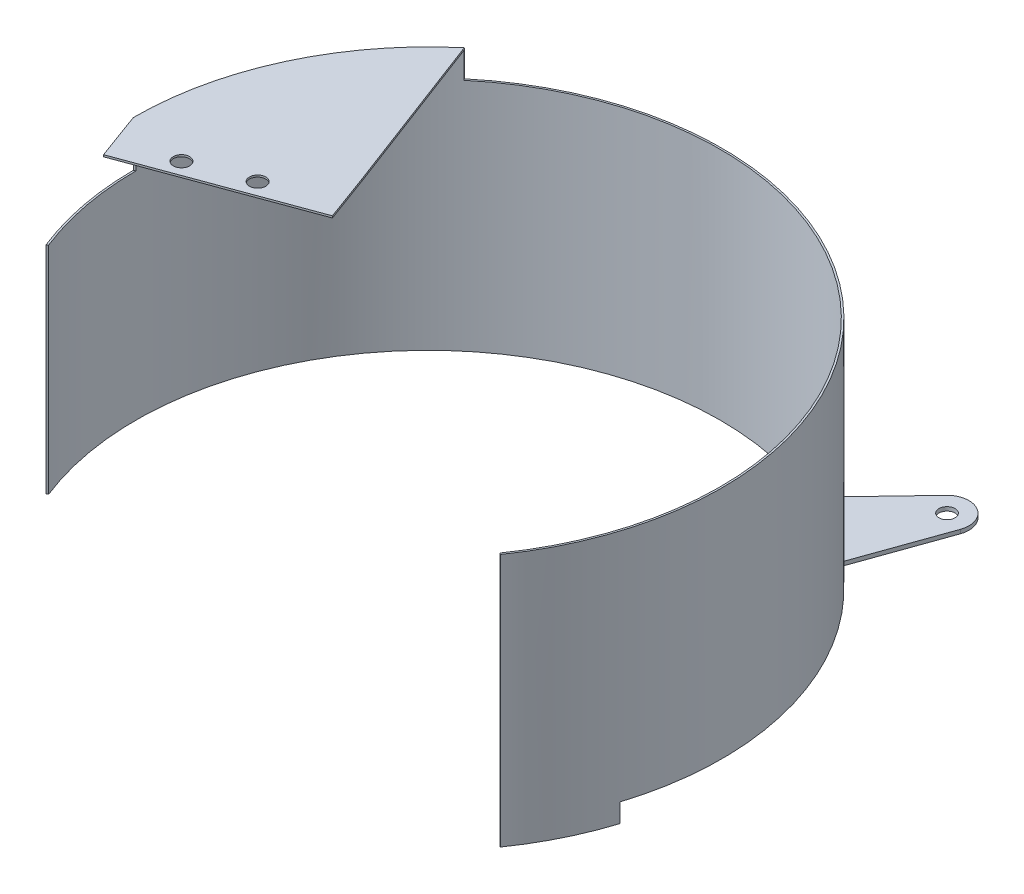
ISO-10303-21;
HEADER;
FILE_DESCRIPTION(('STEP AP214'),'2;1');
FILE_NAME('part.step','',(''),(''),'','','');
FILE_SCHEMA(('AUTOMOTIVE_DESIGN { 1 0 10303 214 1 1 1 1 }'));
ENDSEC;
DATA;
#1=APPLICATION_CONTEXT('core data for automotive mechanical design processes');
#2=APPLICATION_PROTOCOL_DEFINITION('international standard','automotive_design',2000,#1);
#3=PRODUCT_CONTEXT('',#1,'mechanical');
#4=PRODUCT('Part','Part','',(#3));
#5=PRODUCT_RELATED_PRODUCT_CATEGORY('part','',(#4));
#6=PRODUCT_DEFINITION_FORMATION('','',#4);
#7=PRODUCT_DEFINITION_CONTEXT('part definition',#1,'design');
#8=PRODUCT_DEFINITION('design','',#6,#7);
#9=PRODUCT_DEFINITION_SHAPE('','',#8);
#10=(LENGTH_UNIT() NAMED_UNIT(*) SI_UNIT(.MILLI.,.METRE.));
#11=(NAMED_UNIT(*) PLANE_ANGLE_UNIT() SI_UNIT($,.RADIAN.));
#12=(NAMED_UNIT(*) SI_UNIT($,.STERADIAN.) SOLID_ANGLE_UNIT());
#13=UNCERTAINTY_MEASURE_WITH_UNIT(LENGTH_MEASURE(1.E-05),#10,'distance_accuracy_value','');
#14=(GEOMETRIC_REPRESENTATION_CONTEXT(3) GLOBAL_UNCERTAINTY_ASSIGNED_CONTEXT((#13)) GLOBAL_UNIT_ASSIGNED_CONTEXT((#10,
#11,#12)) REPRESENTATION_CONTEXT('',''));
#15=CARTESIAN_POINT('',(0.,0.,0.));
#16=DIRECTION('',(0.,0.,1.));
#17=DIRECTION('',(1.,0.,0.));
#18=AXIS2_PLACEMENT_3D('',#15,#16,#17);
#19=CARTESIAN_POINT('',(-119.379693575983,7.61999999999996,0.2704842037125));
#20=DIRECTION('',(0.344827586206966,0.,0.938666040607988));
#21=DIRECTION('',(0.938666040607988,0.,-0.344827586206966));
#22=AXIS2_PLACEMENT_3D('',#19,#20,#21);
#23=PLANE('',#22);
#24=DIRECTION('',(0.938666040607988,0.,-0.344827586206966));
#25=VECTOR('',#24,1.);
#26=CARTESIAN_POINT('',(-119.379693575983,95.25,0.2704842037125));
#27=LINE('',#26,#25);
#28=CARTESIAN_POINT('',(-119.379693575983,95.25,0.2704842037125));
#29=VERTEX_POINT('',#28);
#30=CARTESIAN_POINT('',(-118.6434,95.25,0.));
#31=VERTEX_POINT('',#30);
#32=EDGE_CURVE('E63',#29,#31,#27,.T.);
#33=ORIENTED_EDGE('',*,*,#32,.T.);
#34=DIRECTION('',(0.,-1.,0.));
#35=VECTOR('',#34,1.);
#36=CARTESIAN_POINT('',(-118.6434,102.87,0.));
#37=LINE('',#36,#35);
#38=CARTESIAN_POINT('',(-118.6434,113.03,0.));
#39=VERTEX_POINT('',#38);
#40=EDGE_CURVE('E325',#39,#31,#37,.T.);
#41=ORIENTED_EDGE('',*,*,#40,.F.);
#42=DIRECTION('',(0.938666040607988,0.,-0.344827586206966));
#43=VECTOR('',#42,1.);
#44=CARTESIAN_POINT('',(-119.379693575983,113.03,0.270484203712493));
#45=LINE('',#44,#43);
#46=CARTESIAN_POINT('',(-119.379693575983,113.03,0.2704842037125));
#47=VERTEX_POINT('',#46);
#48=EDGE_CURVE('E255',#47,#39,#45,.T.);
#49=ORIENTED_EDGE('',*,*,#48,.F.);
#50=DIRECTION('',(0.,1.,0.));
#51=VECTOR('',#50,1.);
#52=CARTESIAN_POINT('',(-119.379693575983,7.61999999999996,0.2704842037125));
#53=LINE('',#52,#51);
#54=EDGE_CURVE('E68',#29,#47,#53,.T.);
#55=ORIENTED_EDGE('',*,*,#54,.F.);
#56=EDGE_LOOP('',(#33,#41,#49,#55));
#57=FACE_BOUND('',#56,.T.);
#58=ADVANCED_FACE('F45',(#57),#23,.T.);
#59=CARTESIAN_POINT('',(-8.68307739513456E-12,113.03,-4.05590009722013E-12));
#60=DIRECTION('',(0.,-1.,0.));
#61=DIRECTION('',(0.,0.,-1.));
#62=AXIS2_PLACEMENT_3D('',#59,#60,#61);
#63=PLANE('',#62);
#64=DIRECTION('',(-0.354304631179803,0.,-0.935130059577032));
#65=VECTOR('',#64,1.);
#66=CARTESIAN_POINT('',(-51.440692330775,113.03,-24.6875315284033));
#67=LINE('',#66,#65);
#68=CARTESIAN_POINT('',(-76.4594448936933,113.03,-90.7205029202786));
#69=VERTEX_POINT('',#68);
#70=CARTESIAN_POINT('',(-76.7359848443851,113.03,-91.4503856195385));
#71=VERTEX_POINT('',#70);
#72=EDGE_CURVE('E11',#69,#71,#67,.T.);
#73=ORIENTED_EDGE('',*,*,#72,.F.);
#74=CARTESIAN_POINT('',(-8.68307739513456E-12,113.03,-4.05590009722013E-12));
#75=DIRECTION('',(0.,-1.,0.));
#76=DIRECTION('',(0.,0.,-1.));
#77=AXIS2_PLACEMENT_3D('',#74,#75,#76);
#78=CIRCLE('',#77,118.643399999991);
#79=CARTESIAN_POINT('',(-76.26250749109,113.03,-90.8861172827371));
#80=VERTEX_POINT('',#79);
#81=EDGE_CURVE('E295',#69,#80,#78,.T.);
#82=ORIENTED_EDGE('',*,*,#81,.T.);
#83=DIRECTION('',(-0.642787609686567,0.,-0.766044443118955));
#84=VECTOR('',#83,1.);
#85=CARTESIAN_POINT('',(-76.7359848443851,113.03,-91.4503856195385));
#86=LINE('',#85,#84);
#87=EDGE_CURVE('E294',#80,#71,#86,.T.);
#88=ORIENTED_EDGE('',*,*,#87,.T.);
#89=EDGE_LOOP('',(#73,#82,#88));
#90=FACE_BOUND('',#89,.T.);
#91=ADVANCED_FACE('F380',(#90),#63,.F.);
#92=CARTESIAN_POINT('',(0.,102.87,0.));
#93=DIRECTION('',(0.,-1.,0.));
#94=DIRECTION('',(0.,0.,-1.));
#95=AXIS2_PLACEMENT_3D('',#92,#93,#94);
#96=CYLINDRICAL_SURFACE('',#95,118.6434);
#97=CARTESIAN_POINT('',(0.,7.62,0.));
#98=DIRECTION('',(0.,-1.,0.));
#99=DIRECTION('',(0.,0.,-1.));
#100=AXIS2_PLACEMENT_3D('',#97,#98,#99);
#101=CIRCLE('',#100,118.6434);
#102=CARTESIAN_POINT('',(-110.311843525834,7.62,43.6755485539894));
#103=VERTEX_POINT('',#102);
#104=CARTESIAN_POINT('',(113.152221674402,7.62,35.6767584529046));
#105=VERTEX_POINT('',#104);
#106=EDGE_CURVE('E175',#103,#105,#101,.T.);
#107=ORIENTED_EDGE('',*,*,#106,.T.);
#108=DIRECTION('',(0.,-1.,0.));
#109=VECTOR('',#108,1.);
#110=CARTESIAN_POINT('',(113.152221674402,7.62,35.6767584529046));
#111=LINE('',#110,#109);
#112=CARTESIAN_POINT('',(113.152221674402,0.,35.6767584529048));
#113=VERTEX_POINT('',#112);
#114=EDGE_CURVE('E307',#105,#113,#111,.T.);
#115=ORIENTED_EDGE('',*,*,#114,.T.);
#116=CARTESIAN_POINT('',(0.,0.,0.));
#117=DIRECTION('',(0.,1.,0.));
#118=DIRECTION('',(1.,0.,0.));
#119=AXIS2_PLACEMENT_3D('',#116,#117,#118);
#120=CIRCLE('',#119,118.6434);
#121=CARTESIAN_POINT('',(97.186983651397,0.,68.0510585685711));
#122=VERTEX_POINT('',#121);
#123=EDGE_CURVE('E186',#113,#122,#120,.F.);
#124=ORIENTED_EDGE('',*,*,#123,.T.);
#125=DIRECTION('',(0.,-1.,0.));
#126=VECTOR('',#125,1.);
#127=CARTESIAN_POINT('',(97.186983651397,102.87,68.0510585685711));
#128=LINE('',#127,#126);
#129=CARTESIAN_POINT('',(97.186983651397,102.87,68.0510585685711));
#130=VERTEX_POINT('',#129);
#131=EDGE_CURVE('E54',#130,#122,#128,.T.);
#132=ORIENTED_EDGE('',*,*,#131,.F.);
#133=CARTESIAN_POINT('',(0.,102.87,0.));
#134=DIRECTION('',(0.,1.,0.));
#135=DIRECTION('',(1.,0.,0.));
#136=AXIS2_PLACEMENT_3D('',#133,#134,#135);
#137=CIRCLE('',#136,118.6434);
#138=CARTESIAN_POINT('',(-76.26250749109,102.87,-90.8861172827371));
#139=VERTEX_POINT('',#138);
#140=EDGE_CURVE('E317',#139,#130,#137,.F.);
#141=ORIENTED_EDGE('',*,*,#140,.F.);
#142=DIRECTION('',(0.,-1.,0.));
#143=VECTOR('',#142,1.);
#144=CARTESIAN_POINT('',(-76.26250749109,113.03,-90.8861172827371));
#145=LINE('',#144,#143);
#146=EDGE_CURVE('E303',#80,#139,#145,.T.);
#147=ORIENTED_EDGE('',*,*,#146,.F.);
#148=ORIENTED_EDGE('',*,*,#81,.F.);
#149=EDGE_CURVE('E291',#39,#69,#78,.T.);
#150=ORIENTED_EDGE('',*,*,#149,.F.);
#151=ORIENTED_EDGE('',*,*,#40,.T.);
#152=CARTESIAN_POINT('',(0.,95.25,0.));
#153=DIRECTION('',(0.,1.,0.));
#154=DIRECTION('',(0.,0.,1.));
#155=AXIS2_PLACEMENT_3D('',#152,#153,#154);
#156=CIRCLE('',#155,118.6434);
#157=CARTESIAN_POINT('',(-110.311843525834,95.25,43.6755485539894));
#158=VERTEX_POINT('',#157);
#159=EDGE_CURVE('E192',#31,#158,#156,.T.);
#160=ORIENTED_EDGE('',*,*,#159,.T.);
#161=DIRECTION('',(0.,1.,0.));
#162=VECTOR('',#161,1.);
#163=CARTESIAN_POINT('',(-110.311843525834,-37.4986959455729,43.6755485539894));
#164=LINE('',#163,#162);
#165=EDGE_CURVE('E190',#103,#158,#164,.T.);
#166=ORIENTED_EDGE('',*,*,#165,.F.);
#167=EDGE_LOOP('',(#107,#115,#124,#132,#141,#147,#148,#150,#151,#160,#166));
#168=FACE_BOUND('',#167,.T.);
#169=ADVANCED_FACE('F47',(#168),#96,.F.);
#170=CARTESIAN_POINT('',(0.,102.87,0.));
#171=DIRECTION('',(0.,-1.,0.));
#172=DIRECTION('',(0.,0.,-1.));
#173=AXIS2_PLACEMENT_3D('',#170,#171,#172);
#174=CYLINDRICAL_SURFACE('',#173,119.38);
#175=DIRECTION('',(0.,-1.,0.));
#176=VECTOR('',#175,1.);
#177=CARTESIAN_POINT('',(76.0548796235913,9.2075,-92.0176053015999));
#178=LINE('',#177,#176);
#179=CARTESIAN_POINT('',(76.0548796235913,9.2075,-92.0176053015999));
#180=VERTEX_POINT('',#179);
#181=CARTESIAN_POINT('',(76.0548796235913,7.62,-92.0176053015999));
#182=VERTEX_POINT('',#181);
#183=EDGE_CURVE('E235',#180,#182,#178,.T.);
#184=ORIENTED_EDGE('',*,*,#183,.F.);
#185=CARTESIAN_POINT('',(0.,9.2075,0.));
#186=DIRECTION('',(0.,1.,0.));
#187=DIRECTION('',(0.,0.,-1.));
#188=AXIS2_PLACEMENT_3D('',#185,#186,#187);
#189=CIRCLE('',#188,119.38);
#190=CARTESIAN_POINT('',(47.938477771701,9.2075,-109.332002400633));
#191=VERTEX_POINT('',#190);
#192=EDGE_CURVE('E215',#180,#191,#189,.T.);
#193=ORIENTED_EDGE('',*,*,#192,.T.);
#194=DIRECTION('',(0.,-1.,0.));
#195=VECTOR('',#194,1.);
#196=CARTESIAN_POINT('',(47.938477771701,9.2075,-109.332002400633));
#197=LINE('',#196,#195);
#198=CARTESIAN_POINT('',(47.938477771701,7.62,-109.332002400633));
#199=VERTEX_POINT('',#198);
#200=EDGE_CURVE('E228',#191,#199,#197,.T.);
#201=ORIENTED_EDGE('',*,*,#200,.T.);
#202=CARTESIAN_POINT('',(0.,7.62,0.));
#203=DIRECTION('',(0.,-1.,0.));
#204=DIRECTION('',(0.,0.,-1.));
#205=AXIS2_PLACEMENT_3D('',#202,#203,#204);
#206=CIRCLE('',#205,119.38);
#207=CARTESIAN_POINT('',(-110.896860102994,7.62,44.1980861497088));
#208=VERTEX_POINT('',#207);
#209=EDGE_CURVE('E187',#208,#199,#206,.T.);
#210=ORIENTED_EDGE('',*,*,#209,.F.);
#211=DIRECTION('',(0.,1.,0.));
#212=VECTOR('',#211,1.);
#213=CARTESIAN_POINT('',(-110.896860102994,-37.4986959455729,44.1980861497088));
#214=LINE('',#213,#212);
#215=CARTESIAN_POINT('',(-110.896860102994,95.25,44.1980861497088));
#216=VERTEX_POINT('',#215);
#217=EDGE_CURVE('E200',#208,#216,#214,.T.);
#218=ORIENTED_EDGE('',*,*,#217,.T.);
#219=CARTESIAN_POINT('',(0.,95.25,0.));
#220=DIRECTION('',(0.,-1.,0.));
#221=DIRECTION('',(0.,0.,1.));
#222=AXIS2_PLACEMENT_3D('',#219,#220,#221);
#223=CIRCLE('',#222,119.38);
#224=EDGE_CURVE('E208',#216,#29,#223,.T.);
#225=ORIENTED_EDGE('',*,*,#224,.T.);
#226=ORIENTED_EDGE('',*,*,#54,.T.);
#227=DIRECTION('',(0.,-1.,0.));
#228=VECTOR('',#227,1.);
#229=CARTESIAN_POINT('',(-119.379693575983,113.792,0.270484203712493));
#230=LINE('',#229,#228);
#231=CARTESIAN_POINT('',(-119.379693575983,113.792,0.2704842037125));
#232=VERTEX_POINT('',#231);
#233=EDGE_CURVE('E262',#232,#47,#230,.T.);
#234=ORIENTED_EDGE('',*,*,#233,.F.);
#235=CARTESIAN_POINT('',(-7.99360577730113E-12,113.792,-3.73312492030209E-12));
#236=DIRECTION('',(0.,1.,0.));
#237=DIRECTION('',(0.,0.,-1.));
#238=AXIS2_PLACEMENT_3D('',#235,#236,#237);
#239=CIRCLE('',#238,119.379999999992);
#240=CARTESIAN_POINT('',(-76.7359848443851,113.792,-91.4503856195385));
#241=VERTEX_POINT('',#240);
#242=EDGE_CURVE('E278',#241,#232,#239,.T.);
#243=ORIENTED_EDGE('',*,*,#242,.F.);
#244=DIRECTION('',(0.,-1.,0.));
#245=VECTOR('',#244,1.);
#246=CARTESIAN_POINT('',(-76.7359848443851,113.792,-91.4503856195385));
#247=LINE('',#246,#245);
#248=EDGE_CURVE('E282',#241,#71,#247,.T.);
#249=ORIENTED_EDGE('',*,*,#248,.T.);
#250=DIRECTION('',(0.,-1.,0.));
#251=VECTOR('',#250,1.);
#252=CARTESIAN_POINT('',(-76.7359848443851,113.03,-91.4503856195385));
#253=LINE('',#252,#251);
#254=CARTESIAN_POINT('',(-76.7359848443851,102.87,-91.4503856195385));
#255=VERTEX_POINT('',#254);
#256=EDGE_CURVE('E298',#71,#255,#253,.T.);
#257=ORIENTED_EDGE('',*,*,#256,.T.);
#258=CARTESIAN_POINT('',(0.,102.87,0.));
#259=DIRECTION('',(0.,-1.,0.));
#260=DIRECTION('',(0.,0.,-1.));
#261=AXIS2_PLACEMENT_3D('',#258,#259,#260);
#262=CIRCLE('',#261,119.38);
#263=CARTESIAN_POINT('',(97.7903710472203,102.87,68.4735549715873));
#264=VERTEX_POINT('',#263);
#265=EDGE_CURVE('E323',#255,#264,#262,.T.);
#266=ORIENTED_EDGE('',*,*,#265,.T.);
#267=DIRECTION('',(0.,-1.,0.));
#268=VECTOR('',#267,1.);
#269=CARTESIAN_POINT('',(97.7903710472203,102.87,68.4735549715873));
#270=LINE('',#269,#268);
#271=CARTESIAN_POINT('',(97.7903710472203,0.,68.4735549715873));
#272=VERTEX_POINT('',#271);
#273=EDGE_CURVE('E332',#264,#272,#270,.T.);
#274=ORIENTED_EDGE('',*,*,#273,.T.);
#275=CARTESIAN_POINT('',(0.,0.,0.));
#276=DIRECTION('',(0.,-1.,0.));
#277=DIRECTION('',(0.,0.,-1.));
#278=AXIS2_PLACEMENT_3D('',#275,#276,#277);
#279=CIRCLE('',#278,119.38);
#280=CARTESIAN_POINT('',(113.854729580324,0.,35.8982583448194));
#281=VERTEX_POINT('',#280);
#282=EDGE_CURVE('E320',#281,#272,#279,.T.);
#283=ORIENTED_EDGE('',*,*,#282,.F.);
#284=DIRECTION('',(0.,-1.,0.));
#285=VECTOR('',#284,1.);
#286=CARTESIAN_POINT('',(113.854729580324,102.87,35.8982583448194));
#287=LINE('',#286,#285);
#288=CARTESIAN_POINT('',(113.854729580324,7.62,35.8982583448194));
#289=VERTEX_POINT('',#288);
#290=EDGE_CURVE('E308',#289,#281,#287,.T.);
#291=ORIENTED_EDGE('',*,*,#290,.F.);
#292=EDGE_CURVE('E314',#182,#289,#206,.T.);
#293=ORIENTED_EDGE('',*,*,#292,.F.);
#294=EDGE_LOOP('',(#184,#193,#201,#210,#218,#225,#226,#234,#243,#249,#257,#266,#274,#283,#291,#293));
#295=FACE_BOUND('',#294,.T.);
#296=ADVANCED_FACE('F372',(#295),#174,.T.);
#297=CARTESIAN_POINT('',(0.,0.,0.));
#298=DIRECTION('',(0.,1.,0.));
#299=DIRECTION('',(1.,0.,0.));
#300=AXIS2_PLACEMENT_3D('',#297,#298,#299);
#301=PLANE('',#300);
#302=DIRECTION('',(-0.953716950748228,0.,-0.300705799504269));
#303=VECTOR('',#302,1.);
#304=CARTESIAN_POINT('',(113.152221674402,0.,35.6767584529048));
#305=LINE('',#304,#303);
#306=EDGE_CURVE('E311',#113,#281,#305,.F.);
#307=ORIENTED_EDGE('',*,*,#306,.T.);
#308=ORIENTED_EDGE('',*,*,#282,.T.);
#309=DIRECTION('',(-0.819152044289029,0.,-0.573576436350992));
#310=VECTOR('',#309,1.);
#311=CARTESIAN_POINT('',(97.7903710472203,0.,68.4735549715873));
#312=LINE('',#311,#310);
#313=EDGE_CURVE('E327',#272,#122,#312,.T.);
#314=ORIENTED_EDGE('',*,*,#313,.T.);
#315=ORIENTED_EDGE('',*,*,#123,.F.);
#316=EDGE_LOOP('',(#307,#308,#314,#315));
#317=FACE_BOUND('',#316,.T.);
#318=ADVANCED_FACE('F395',(#317),#301,.F.);
#319=CARTESIAN_POINT('',(97.7903710472203,102.87,68.4735549715873));
#320=DIRECTION('',(-0.573576436350992,0.,0.81915204428903));
#321=DIRECTION('',(0.81915204428903,0.,0.573576436350992));
#322=AXIS2_PLACEMENT_3D('',#319,#320,#321);
#323=PLANE('',#322);
#324=ORIENTED_EDGE('',*,*,#313,.F.);
#325=ORIENTED_EDGE('',*,*,#273,.F.);
#326=DIRECTION('',(-0.819152044289029,0.,-0.573576436350992));
#327=VECTOR('',#326,1.);
#328=CARTESIAN_POINT('',(97.7903710472203,102.87,68.4735549715873));
#329=LINE('',#328,#327);
#330=EDGE_CURVE('E319',#264,#130,#329,.T.);
#331=ORIENTED_EDGE('',*,*,#330,.T.);
#332=ORIENTED_EDGE('',*,*,#131,.T.);
#333=EDGE_LOOP('',(#324,#325,#331,#332));
#334=FACE_BOUND('',#333,.T.);
#335=ADVANCED_FACE('F390',(#334),#323,.T.);
#336=CARTESIAN_POINT('',(0.,102.87,0.));
#337=DIRECTION('',(0.,1.,0.));
#338=DIRECTION('',(1.,0.,0.));
#339=AXIS2_PLACEMENT_3D('',#336,#337,#338);
#340=PLANE('',#339);
#341=DIRECTION('',(-0.642787609686567,0.,-0.766044443118955));
#342=VECTOR('',#341,1.);
#343=CARTESIAN_POINT('',(-76.7359848443851,102.87,-91.4503856195385));
#344=LINE('',#343,#342);
#345=EDGE_CURVE('E290',#139,#255,#344,.T.);
#346=ORIENTED_EDGE('',*,*,#345,.F.);
#347=ORIENTED_EDGE('',*,*,#140,.T.);
#348=ORIENTED_EDGE('',*,*,#330,.F.);
#349=ORIENTED_EDGE('',*,*,#265,.F.);
#350=EDGE_LOOP('',(#346,#347,#348,#349));
#351=FACE_BOUND('',#350,.T.);
#352=ADVANCED_FACE('F387',(#351),#340,.T.);
#353=CARTESIAN_POINT('',(0.,7.62,0.));
#354=DIRECTION('',(0.,1.,0.));
#355=DIRECTION('',(0.,0.,1.));
#356=AXIS2_PLACEMENT_3D('',#353,#354,#355);
#357=PLANE('',#356);
#358=ORIENTED_EDGE('',*,*,#106,.F.);
#359=DIRECTION('',(0.745810111733346,0.,-0.666158597659968));
#360=VECTOR('',#359,1.);
#361=CARTESIAN_POINT('',(-110.311843525834,7.62,43.6755485539894));
#362=LINE('',#361,#360);
#363=EDGE_CURVE('E181',#103,#208,#362,.F.);
#364=ORIENTED_EDGE('',*,*,#363,.T.);
#365=ORIENTED_EDGE('',*,*,#209,.T.);
#366=DIRECTION('',(0.690007892958849,0.,-0.723801842809542));
#367=VECTOR('',#366,1.);
#368=CARTESIAN_POINT('',(73.8609896705439,7.62,-136.524099873863));
#369=LINE('',#368,#367);
#370=CARTESIAN_POINT('',(73.8609896705439,7.62,-136.524099873863));
#371=VERTEX_POINT('',#370);
#372=EDGE_CURVE('E213',#199,#371,#369,.T.);
#373=ORIENTED_EDGE('',*,*,#372,.T.);
#374=CARTESIAN_POINT('',(80.2955880531208,7.62,-130.389929705459));
#375=DIRECTION('',(0.,-1.,0.));
#376=DIRECTION('',(0.,0.,1.));
#377=AXIS2_PLACEMENT_3D('',#374,#375,#376);
#378=CIRCLE('',#377,8.89);
#379=CARTESIAN_POINT('',(88.6694516172861,7.62,-127.404882133184));
#380=VERTEX_POINT('',#379);
#381=EDGE_CURVE('E231',#371,#380,#378,.T.);
#382=ORIENTED_EDGE('',*,*,#381,.T.);
#383=DIRECTION('',(-0.335775879895944,0.,0.94194190823007));
#384=VECTOR('',#383,1.);
#385=CARTESIAN_POINT('',(76.0548796235913,7.62,-92.0176053015999));
#386=LINE('',#385,#384);
#387=EDGE_CURVE('E219',#380,#182,#386,.T.);
#388=ORIENTED_EDGE('',*,*,#387,.T.);
#389=ORIENTED_EDGE('',*,*,#292,.T.);
#390=DIRECTION('',(-0.953716950748229,0.,-0.300705799504267));
#391=VECTOR('',#390,1.);
#392=CARTESIAN_POINT('',(113.152221674402,7.62,35.6767584529046));
#393=LINE('',#392,#391);
#394=EDGE_CURVE('E183',#105,#289,#393,.F.);
#395=ORIENTED_EDGE('',*,*,#394,.F.);
#396=EDGE_LOOP('',(#358,#364,#365,#373,#382,#388,#389,#395));
#397=FACE_BOUND('',#396,.T.);
#398=CARTESIAN_POINT('',(80.2955880531208,7.62,-130.389929705459));
#399=DIRECTION('',(0.,-1.,0.));
#400=DIRECTION('',(0.,0.,-1.));
#401=AXIS2_PLACEMENT_3D('',#398,#399,#400);
#402=CIRCLE('',#401,3.26389999999999);
#403=CARTESIAN_POINT('',(80.2955880531208,7.62,-133.653829705459));
#404=VERTEX_POINT('',#403);
#405=EDGE_CURVE('E201',#404,#404,#402,.T.);
#406=ORIENTED_EDGE('',*,*,#405,.F.);
#407=EDGE_LOOP('',(#406));
#408=FACE_BOUND('',#407,.T.);
#409=ADVANCED_FACE('F177',(#397,#408),#357,.F.);
#410=CARTESIAN_POINT('',(113.152221674402,3.81,35.6767584529046));
#411=DIRECTION('',(-0.300705799504267,0.,0.953716950748229));
#412=DIRECTION('',(0.,-1.,0.));
#413=AXIS2_PLACEMENT_3D('',#410,#411,#412);
#414=PLANE('',#413);
#415=ORIENTED_EDGE('',*,*,#306,.F.);
#416=ORIENTED_EDGE('',*,*,#114,.F.);
#417=ORIENTED_EDGE('',*,*,#394,.T.);
#418=ORIENTED_EDGE('',*,*,#290,.T.);
#419=EDGE_LOOP('',(#415,#416,#417,#418));
#420=FACE_BOUND('',#419,.T.);
#421=ADVANCED_FACE('F398',(#420),#414,.F.);
#422=CARTESIAN_POINT('',(-76.7359848443851,113.03,-91.4503856195385));
#423=DIRECTION('',(-0.766044443118955,0.,0.642787609686567));
#424=DIRECTION('',(0.642787609686567,0.,0.766044443118955));
#425=AXIS2_PLACEMENT_3D('',#422,#423,#424);
#426=PLANE('',#425);
#427=ORIENTED_EDGE('',*,*,#345,.T.);
#428=ORIENTED_EDGE('',*,*,#256,.F.);
#429=ORIENTED_EDGE('',*,*,#87,.F.);
#430=ORIENTED_EDGE('',*,*,#146,.T.);
#431=EDGE_LOOP('',(#427,#428,#429,#430));
#432=FACE_BOUND('',#431,.T.);
#433=ADVANCED_FACE('F378',(#432),#426,.F.);
#434=CARTESIAN_POINT('',(-51.440692330775,113.792,-24.6875315284033));
#435=DIRECTION('',(-0.935130059577032,0.,0.354304631179803));
#436=DIRECTION('',(0.354304631179803,0.,0.935130059577032));
#437=AXIS2_PLACEMENT_3D('',#434,#435,#436);
#438=PLANE('',#437);
#439=CARTESIAN_POINT('',(-51.440692330775,113.03,-24.6875315284033));
#440=VERTEX_POINT('',#439);
#441=EDGE_CURVE('E56',#440,#69,#67,.T.);
#442=ORIENTED_EDGE('',*,*,#441,.T.);
#443=ORIENTED_EDGE('',*,*,#72,.T.);
#444=ORIENTED_EDGE('',*,*,#248,.F.);
#445=DIRECTION('',(-0.354304631179803,0.,-0.935130059577032));
#446=VECTOR('',#445,1.);
#447=CARTESIAN_POINT('',(-51.440692330775,113.792,-24.6875315284033));
#448=LINE('',#447,#446);
#449=CARTESIAN_POINT('',(-51.440692330775,113.792,-24.6875315284033));
#450=VERTEX_POINT('',#449);
#451=EDGE_CURVE('E281',#450,#241,#448,.T.);
#452=ORIENTED_EDGE('',*,*,#451,.F.);
#453=DIRECTION('',(0.,-1.,0.));
#454=VECTOR('',#453,1.);
#455=CARTESIAN_POINT('',(-51.440692330775,113.792,-24.6875315284033));
#456=LINE('',#455,#454);
#457=EDGE_CURVE('E287',#450,#440,#456,.T.);
#458=ORIENTED_EDGE('',*,*,#457,.T.);
#459=EDGE_LOOP('',(#442,#443,#444,#452,#458));
#460=FACE_BOUND('',#459,.T.);
#461=ADVANCED_FACE('F357',(#460),#438,.F.);
#462=CARTESIAN_POINT('',(-7.99360577730113E-12,113.792,-3.73312492030209E-12));
#463=DIRECTION('',(0.,-1.,0.));
#464=DIRECTION('',(0.,0.,-1.));
#465=AXIS2_PLACEMENT_3D('',#462,#463,#464);
#466=PLANE('',#465);
#467=CARTESIAN_POINT('',(-94.2586622610647,113.792,5.86092858076518));
#468=DIRECTION('',(0.,1.,0.));
#469=DIRECTION('',(0.,0.,1.));
#470=AXIS2_PLACEMENT_3D('',#467,#468,#469);
#471=CIRCLE('',#470,3.30000000000001);
#472=CARTESIAN_POINT('',(-94.2586622610647,113.792,9.16092858076519));
#473=VERTEX_POINT('',#472);
#474=EDGE_CURVE('E245',#473,#473,#471,.T.);
#475=ORIENTED_EDGE('',*,*,#474,.F.);
#476=EDGE_LOOP('',(#475));
#477=FACE_BOUND('',#476,.T.);
#478=CARTESIAN_POINT('',(-71.6339672349805,113.792,-2.45049328494981));
#479=DIRECTION('',(0.,1.,0.));
#480=DIRECTION('',(0.,0.,1.));
#481=AXIS2_PLACEMENT_3D('',#478,#479,#480);
#482=CIRCLE('',#481,3.30000000000002);
#483=CARTESIAN_POINT('',(-71.6339672349805,113.792,0.849506715050206));
#484=VERTEX_POINT('',#483);
#485=EDGE_CURVE('E238',#484,#484,#482,.T.);
#486=ORIENTED_EDGE('',*,*,#485,.F.);
#487=EDGE_LOOP('',(#486));
#488=FACE_BOUND('',#487,.T.);
#489=ORIENTED_EDGE('',*,*,#242,.T.);
#490=DIRECTION('',(-0.344827586206966,0.,-0.938666040607989));
#491=VECTOR('',#490,1.);
#492=CARTESIAN_POINT('',(-112.366400603568,113.792,19.361590047227));
#493=LINE('',#492,#491);
#494=CARTESIAN_POINT('',(-112.366400603568,113.792,19.361590047227));
#495=VERTEX_POINT('',#494);
#496=EDGE_CURVE('E261',#495,#232,#493,.T.);
#497=ORIENTED_EDGE('',*,*,#496,.F.);
#498=DIRECTION('',(-0.938666040607988,0.,0.344827586206966));
#499=VECTOR('',#498,1.);
#500=CARTESIAN_POINT('',(-112.366400603568,113.792,19.361590047227));
#501=LINE('',#500,#499);
#502=CARTESIAN_POINT('',(-44.4273993583598,113.792,-5.59642568488879));
#503=VERTEX_POINT('',#502);
#504=EDGE_CURVE('E259',#503,#495,#501,.T.);
#505=ORIENTED_EDGE('',*,*,#504,.F.);
#506=DIRECTION('',(-0.344827586206966,0.,-0.938666040607989));
#507=VECTOR('',#506,1.);
#508=CARTESIAN_POINT('',(-44.4273993583598,113.792,-5.59642568488879));
#509=LINE('',#508,#507);
#510=EDGE_CURVE('E269',#503,#450,#509,.T.);
#511=ORIENTED_EDGE('',*,*,#510,.T.);
#512=ORIENTED_EDGE('',*,*,#451,.T.);
#513=EDGE_LOOP('',(#489,#497,#505,#511,#512));
#514=FACE_BOUND('',#513,.T.);
#515=ADVANCED_FACE('F349',(#477,#488,#514),#466,.F.);
#516=CARTESIAN_POINT('',(-7.99360577730113E-12,113.03,-3.73312492030209E-12));
#517=DIRECTION('',(0.,-1.,0.));
#518=DIRECTION('',(0.,0.,-1.));
#519=AXIS2_PLACEMENT_3D('',#516,#517,#518);
#520=PLANE('',#519);
#521=CARTESIAN_POINT('',(-94.2586622610647,113.03,5.86092858076518));
#522=DIRECTION('',(0.,-1.,0.));
#523=DIRECTION('',(0.,0.,-1.));
#524=AXIS2_PLACEMENT_3D('',#521,#522,#523);
#525=CIRCLE('',#524,3.30000000000001);
#526=CARTESIAN_POINT('',(-94.2586622610647,113.03,9.16092858076519));
#527=VERTEX_POINT('',#526);
#528=EDGE_CURVE('E49',#527,#527,#525,.T.);
#529=ORIENTED_EDGE('',*,*,#528,.F.);
#530=EDGE_LOOP('',(#529));
#531=FACE_BOUND('',#530,.T.);
#532=CARTESIAN_POINT('',(-71.6339672349805,113.03,-2.45049328494981));
#533=DIRECTION('',(0.,-1.,0.));
#534=DIRECTION('',(0.,0.,-1.));
#535=AXIS2_PLACEMENT_3D('',#532,#533,#534);
#536=CIRCLE('',#535,3.30000000000002);
#537=CARTESIAN_POINT('',(-71.6339672349805,113.03,0.849506715050206));
#538=VERTEX_POINT('',#537);
#539=EDGE_CURVE('E248',#538,#538,#536,.T.);
#540=ORIENTED_EDGE('',*,*,#539,.F.);
#541=EDGE_LOOP('',(#540));
#542=FACE_BOUND('',#541,.T.);
#543=ORIENTED_EDGE('',*,*,#441,.F.);
#544=DIRECTION('',(-0.344827586206966,0.,-0.938666040607989));
#545=VECTOR('',#544,1.);
#546=CARTESIAN_POINT('',(-44.4273993583598,113.03,-5.59642568488879));
#547=LINE('',#546,#545);
#548=CARTESIAN_POINT('',(-44.4273993583598,113.03,-5.59642568488879));
#549=VERTEX_POINT('',#548);
#550=EDGE_CURVE('E272',#549,#440,#547,.T.);
#551=ORIENTED_EDGE('',*,*,#550,.F.);
#552=DIRECTION('',(0.938666040607988,0.,-0.344827586206966));
#553=VECTOR('',#552,1.);
#554=CARTESIAN_POINT('',(-112.366400603568,113.03,19.361590047227));
#555=LINE('',#554,#553);
#556=CARTESIAN_POINT('',(-112.366400603568,113.03,19.361590047227));
#557=VERTEX_POINT('',#556);
#558=EDGE_CURVE('E254',#557,#549,#555,.T.);
#559=ORIENTED_EDGE('',*,*,#558,.F.);
#560=DIRECTION('',(-0.344827586206966,0.,-0.938666040607989));
#561=VECTOR('',#560,1.);
#562=CARTESIAN_POINT('',(-112.366400603568,113.03,19.361590047227));
#563=LINE('',#562,#561);
#564=EDGE_CURVE('E275',#557,#47,#563,.T.);
#565=ORIENTED_EDGE('',*,*,#564,.T.);
#566=ORIENTED_EDGE('',*,*,#48,.T.);
#567=ORIENTED_EDGE('',*,*,#149,.T.);
#568=EDGE_LOOP('',(#543,#551,#559,#565,#566,#567));
#569=FACE_BOUND('',#568,.T.);
#570=ADVANCED_FACE('F345',(#531,#542,#569),#520,.T.);
#571=CARTESIAN_POINT('',(-112.366400603568,113.792,19.361590047227));
#572=DIRECTION('',(0.938666040607989,0.,-0.344827586206966));
#573=DIRECTION('',(-0.344827586206966,0.,-0.938666040607989));
#574=AXIS2_PLACEMENT_3D('',#571,#572,#573);
#575=PLANE('',#574);
#576=ORIENTED_EDGE('',*,*,#233,.T.);
#577=ORIENTED_EDGE('',*,*,#564,.F.);
#578=DIRECTION('',(0.,-1.,0.));
#579=VECTOR('',#578,1.);
#580=CARTESIAN_POINT('',(-112.366400603568,113.792,19.361590047227));
#581=LINE('',#580,#579);
#582=EDGE_CURVE('E251',#495,#557,#581,.T.);
#583=ORIENTED_EDGE('',*,*,#582,.F.);
#584=ORIENTED_EDGE('',*,*,#496,.T.);
#585=EDGE_LOOP('',(#576,#577,#583,#584));
#586=FACE_BOUND('',#585,.T.);
#587=ADVANCED_FACE('F348',(#586),#575,.F.);
#588=CARTESIAN_POINT('',(-44.4273993583598,113.792,-5.59642568488879));
#589=DIRECTION('',(-0.938666040607989,0.,0.344827586206966));
#590=DIRECTION('',(0.344827586206966,0.,0.938666040607989));
#591=AXIS2_PLACEMENT_3D('',#588,#589,#590);
#592=PLANE('',#591);
#593=ORIENTED_EDGE('',*,*,#457,.F.);
#594=ORIENTED_EDGE('',*,*,#510,.F.);
#595=DIRECTION('',(0.,1.,0.));
#596=VECTOR('',#595,1.);
#597=CARTESIAN_POINT('',(-44.4273993583598,113.792,-5.59642568488879));
#598=LINE('',#597,#596);
#599=EDGE_CURVE('E257',#549,#503,#598,.T.);
#600=ORIENTED_EDGE('',*,*,#599,.F.);
#601=ORIENTED_EDGE('',*,*,#550,.T.);
#602=EDGE_LOOP('',(#593,#594,#600,#601));
#603=FACE_BOUND('',#602,.T.);
#604=ADVANCED_FACE('F361',(#603),#592,.F.);
#605=CARTESIAN_POINT('',(-7.09412676599711,0.,-19.3111460607242));
#606=DIRECTION('',(0.344827586206966,0.,0.938666040607989));
#607=DIRECTION('',(0.938666040607989,0.,-0.344827586206966));
#608=AXIS2_PLACEMENT_3D('',#605,#606,#607);
#609=PLANE('',#608);
#610=ORIENTED_EDGE('',*,*,#582,.T.);
#611=ORIENTED_EDGE('',*,*,#558,.T.);
#612=ORIENTED_EDGE('',*,*,#599,.T.);
#613=ORIENTED_EDGE('',*,*,#504,.T.);
#614=EDGE_LOOP('',(#610,#611,#612,#613));
#615=FACE_BOUND('',#614,.T.);
#616=ADVANCED_FACE('F364',(#615),#609,.T.);
#617=CARTESIAN_POINT('',(-71.6339672349805,0.,-2.45049328494981));
#618=DIRECTION('',(0.,1.,0.));
#619=DIRECTION('',(0.,0.,1.));
#620=AXIS2_PLACEMENT_3D('',#617,#618,#619);
#621=CYLINDRICAL_SURFACE('',#620,3.30000000000002);
#622=CARTESIAN_POINT('',(-71.6339672349805,113.03,0.849506715050206));
#623=CARTESIAN_POINT('',(-71.6339672349805,113.0379375,0.849506715050206));
#624=CARTESIAN_POINT('',(-71.6339672349805,113.045875,0.849506715050206));
#625=CARTESIAN_POINT('',(-71.6339672349805,113.06175,0.849506715050206));
#626=CARTESIAN_POINT('',(-71.6339672349805,113.0696875,0.849506715050206));
#627=CARTESIAN_POINT('',(-71.6339672349805,113.0855625,0.849506715050206));
#628=CARTESIAN_POINT('',(-71.6339672349805,113.0935,0.849506715050206));
#629=CARTESIAN_POINT('',(-71.6339672349805,113.109375,0.849506715050206));
#630=CARTESIAN_POINT('',(-71.6339672349805,113.1173125,0.849506715050206));
#631=CARTESIAN_POINT('',(-71.6339672349805,113.1331875,0.849506715050206));
#632=CARTESIAN_POINT('',(-71.6339672349805,113.141125,0.849506715050206));
#633=CARTESIAN_POINT('',(-71.6339672349805,113.157,0.849506715050206));
#634=CARTESIAN_POINT('',(-71.6339672349805,113.1649375,0.849506715050206));
#635=CARTESIAN_POINT('',(-71.6339672349805,113.1808125,0.849506715050206));
#636=CARTESIAN_POINT('',(-71.6339672349805,113.18875,0.849506715050206));
#637=CARTESIAN_POINT('',(-71.6339672349805,113.204625,0.849506715050206));
#638=CARTESIAN_POINT('',(-71.6339672349805,113.2125625,0.849506715050206));
#639=CARTESIAN_POINT('',(-71.6339672349805,113.2284375,0.849506715050206));
#640=CARTESIAN_POINT('',(-71.6339672349805,113.236375,0.849506715050206));
#641=CARTESIAN_POINT('',(-71.6339672349805,113.25225,0.849506715050206));
#642=CARTESIAN_POINT('',(-71.6339672349805,113.2601875,0.849506715050206));
#643=CARTESIAN_POINT('',(-71.6339672349805,113.2760625,0.849506715050206));
#644=CARTESIAN_POINT('',(-71.6339672349805,113.284,0.849506715050206));
#645=CARTESIAN_POINT('',(-71.6339672349805,113.299875,0.849506715050206));
#646=CARTESIAN_POINT('',(-71.6339672349805,113.3078125,0.849506715050206));
#647=CARTESIAN_POINT('',(-71.6339672349805,113.3236875,0.849506715050206));
#648=CARTESIAN_POINT('',(-71.6339672349805,113.331625,0.849506715050206));
#649=CARTESIAN_POINT('',(-71.6339672349805,113.3475,0.849506715050206));
#650=CARTESIAN_POINT('',(-71.6339672349805,113.3554375,0.849506715050206));
#651=CARTESIAN_POINT('',(-71.6339672349805,113.3713125,0.849506715050206));
#652=CARTESIAN_POINT('',(-71.6339672349805,113.37925,0.849506715050206));
#653=CARTESIAN_POINT('',(-71.6339672349805,113.395125,0.849506715050206));
#654=CARTESIAN_POINT('',(-71.6339672349805,113.4030625,0.849506715050206));
#655=CARTESIAN_POINT('',(-71.6339672349805,113.4189375,0.849506715050206));
#656=CARTESIAN_POINT('',(-71.6339672349805,113.426875,0.849506715050206));
#657=CARTESIAN_POINT('',(-71.6339672349805,113.44275,0.849506715050206));
#658=CARTESIAN_POINT('',(-71.6339672349805,113.4506875,0.849506715050206));
#659=CARTESIAN_POINT('',(-71.6339672349805,113.4665625,0.849506715050206));
#660=CARTESIAN_POINT('',(-71.6339672349805,113.4745,0.849506715050206));
#661=CARTESIAN_POINT('',(-71.6339672349805,113.490375,0.849506715050206));
#662=CARTESIAN_POINT('',(-71.6339672349805,113.4983125,0.849506715050206));
#663=CARTESIAN_POINT('',(-71.6339672349805,113.5141875,0.849506715050206));
#664=CARTESIAN_POINT('',(-71.6339672349805,113.522125,0.849506715050206));
#665=CARTESIAN_POINT('',(-71.6339672349805,113.538,0.849506715050206));
#666=CARTESIAN_POINT('',(-71.6339672349805,113.5459375,0.849506715050206));
#667=CARTESIAN_POINT('',(-71.6339672349805,113.5618125,0.849506715050206));
#668=CARTESIAN_POINT('',(-71.6339672349805,113.56975,0.849506715050206));
#669=CARTESIAN_POINT('',(-71.6339672349805,113.585625,0.849506715050206));
#670=CARTESIAN_POINT('',(-71.6339672349805,113.5935625,0.849506715050206));
#671=CARTESIAN_POINT('',(-71.6339672349805,113.6094375,0.849506715050206));
#672=CARTESIAN_POINT('',(-71.6339672349805,113.617375,0.849506715050206));
#673=CARTESIAN_POINT('',(-71.6339672349805,113.63325,0.849506715050206));
#674=CARTESIAN_POINT('',(-71.6339672349805,113.6411875,0.849506715050206));
#675=CARTESIAN_POINT('',(-71.6339672349805,113.6570625,0.849506715050206));
#676=CARTESIAN_POINT('',(-71.6339672349805,113.665,0.849506715050206));
#677=CARTESIAN_POINT('',(-71.6339672349805,113.680875,0.849506715050206));
#678=CARTESIAN_POINT('',(-71.6339672349805,113.6888125,0.849506715050206));
#679=CARTESIAN_POINT('',(-71.6339672349805,113.7046875,0.849506715050206));
#680=CARTESIAN_POINT('',(-71.6339672349805,113.712625,0.849506715050206));
#681=CARTESIAN_POINT('',(-71.6339672349805,113.7285,0.849506715050206));
#682=CARTESIAN_POINT('',(-71.6339672349805,113.7364375,0.849506715050206));
#683=CARTESIAN_POINT('',(-71.6339672349805,113.7523125,0.849506715050206));
#684=CARTESIAN_POINT('',(-71.6339672349805,113.76025,0.849506715050206));
#685=CARTESIAN_POINT('',(-71.6339672349805,113.776125,0.849506715050206));
#686=CARTESIAN_POINT('',(-71.6339672349805,113.7840625,0.849506715050206));
#687=CARTESIAN_POINT('',(-71.6339672349805,113.792,0.849506715050206));
#688=B_SPLINE_CURVE_WITH_KNOTS('',3,(#622,#623,#624,#625,#626,#627,#628,#629,#630,#631,#632,
#633,#634,#635,#636,#637,#638,#639,#640,#641,#642,#643,#644,#645,#646,#647,#648,#649,#650,#651,
#652,#653,#654,#655,#656,#657,#658,#659,#660,#661,#662,#663,#664,#665,#666,#667,#668,#669,#670,
#671,#672,#673,#674,#675,#676,#677,#678,#679,#680,#681,#682,#683,#684,#685,#686,#687),
.UNSPECIFIED.,.F.,.F.,(4,2,2,2,2,2,2,2,2,2,2,2,2,2,2,2,2,2,2,2,2,2,2,2,2,2,2,2,2,2,2,2,4),(0.,
0.0238124999999978,0.0476249999999956,0.0714374999999934,0.0952499999999912,0.119062500000003,
0.142875000000001,0.166687499999998,0.190499999999996,0.214312499999994,0.238124999999992,
0.26193749999999,0.285750000000001,0.309562499999999,0.333374999999997,0.357187499999995,
0.380999999999992,0.40481249999999,0.428624999999988,0.452437499999986,0.476249999999984,
0.500062499999995,0.523874999999993,0.547687499999991,0.571499999999989,0.595312499999986,
0.619124999999984,0.642937499999982,0.666749999999994,0.690562499999992,0.714374999999989,
0.738187499999987,0.761999999999985),.UNSPECIFIED.);
#689=EDGE_CURVE('BSEAM429',#538,#484,#688,.T.);
#690=ORIENTED_EDGE('',*,*,#539,.T.);
#691=ORIENTED_EDGE('',*,*,#485,.T.);
#692=ORIENTED_EDGE('',*,*,#689,.T.);
#693=ORIENTED_EDGE('',*,*,#689,.F.);
#694=EDGE_LOOP('',(#690,#692,#691,#693));
#695=FACE_BOUND('',#694,.T.);
#696=ADVANCED_FACE('F429',(#695),#621,.F.);
#697=CARTESIAN_POINT('',(-94.2586622610647,0.,5.86092858076518));
#698=DIRECTION('',(0.,1.,0.));
#699=DIRECTION('',(0.,0.,1.));
#700=AXIS2_PLACEMENT_3D('',#697,#698,#699);
#701=CYLINDRICAL_SURFACE('',#700,3.30000000000001);
#702=CARTESIAN_POINT('',(-94.2586622610647,113.03,9.16092858076519));
#703=CARTESIAN_POINT('',(-94.2586622610647,113.0379375,9.16092858076519));
#704=CARTESIAN_POINT('',(-94.2586622610647,113.045875,9.16092858076519));
#705=CARTESIAN_POINT('',(-94.2586622610647,113.06175,9.16092858076519));
#706=CARTESIAN_POINT('',(-94.2586622610647,113.0696875,9.16092858076519));
#707=CARTESIAN_POINT('',(-94.2586622610647,113.0855625,9.16092858076519));
#708=CARTESIAN_POINT('',(-94.2586622610647,113.0935,9.16092858076519));
#709=CARTESIAN_POINT('',(-94.2586622610647,113.109375,9.16092858076519));
#710=CARTESIAN_POINT('',(-94.2586622610647,113.1173125,9.16092858076519));
#711=CARTESIAN_POINT('',(-94.2586622610647,113.1331875,9.16092858076519));
#712=CARTESIAN_POINT('',(-94.2586622610647,113.141125,9.16092858076519));
#713=CARTESIAN_POINT('',(-94.2586622610647,113.157,9.16092858076519));
#714=CARTESIAN_POINT('',(-94.2586622610647,113.1649375,9.16092858076519));
#715=CARTESIAN_POINT('',(-94.2586622610647,113.1808125,9.16092858076519));
#716=CARTESIAN_POINT('',(-94.2586622610647,113.18875,9.16092858076519));
#717=CARTESIAN_POINT('',(-94.2586622610647,113.204625,9.16092858076519));
#718=CARTESIAN_POINT('',(-94.2586622610647,113.2125625,9.16092858076519));
#719=CARTESIAN_POINT('',(-94.2586622610647,113.2284375,9.16092858076519));
#720=CARTESIAN_POINT('',(-94.2586622610647,113.236375,9.16092858076519));
#721=CARTESIAN_POINT('',(-94.2586622610647,113.25225,9.16092858076519));
#722=CARTESIAN_POINT('',(-94.2586622610647,113.2601875,9.16092858076519));
#723=CARTESIAN_POINT('',(-94.2586622610647,113.2760625,9.16092858076519));
#724=CARTESIAN_POINT('',(-94.2586622610647,113.284,9.16092858076519));
#725=CARTESIAN_POINT('',(-94.2586622610647,113.299875,9.16092858076519));
#726=CARTESIAN_POINT('',(-94.2586622610647,113.3078125,9.16092858076519));
#727=CARTESIAN_POINT('',(-94.2586622610647,113.3236875,9.16092858076519));
#728=CARTESIAN_POINT('',(-94.2586622610647,113.331625,9.16092858076519));
#729=CARTESIAN_POINT('',(-94.2586622610647,113.3475,9.16092858076519));
#730=CARTESIAN_POINT('',(-94.2586622610647,113.3554375,9.16092858076519));
#731=CARTESIAN_POINT('',(-94.2586622610647,113.3713125,9.16092858076519));
#732=CARTESIAN_POINT('',(-94.2586622610647,113.37925,9.16092858076519));
#733=CARTESIAN_POINT('',(-94.2586622610647,113.395125,9.16092858076519));
#734=CARTESIAN_POINT('',(-94.2586622610647,113.4030625,9.16092858076519));
#735=CARTESIAN_POINT('',(-94.2586622610647,113.4189375,9.16092858076519));
#736=CARTESIAN_POINT('',(-94.2586622610647,113.426875,9.16092858076519));
#737=CARTESIAN_POINT('',(-94.2586622610647,113.44275,9.16092858076519));
#738=CARTESIAN_POINT('',(-94.2586622610647,113.4506875,9.16092858076519));
#739=CARTESIAN_POINT('',(-94.2586622610647,113.4665625,9.16092858076519));
#740=CARTESIAN_POINT('',(-94.2586622610647,113.4745,9.16092858076519));
#741=CARTESIAN_POINT('',(-94.2586622610647,113.490375,9.16092858076519));
#742=CARTESIAN_POINT('',(-94.2586622610647,113.4983125,9.16092858076519));
#743=CARTESIAN_POINT('',(-94.2586622610647,113.5141875,9.16092858076519));
#744=CARTESIAN_POINT('',(-94.2586622610647,113.522125,9.16092858076519));
#745=CARTESIAN_POINT('',(-94.2586622610647,113.538,9.16092858076519));
#746=CARTESIAN_POINT('',(-94.2586622610647,113.5459375,9.16092858076519));
#747=CARTESIAN_POINT('',(-94.2586622610647,113.5618125,9.16092858076519));
#748=CARTESIAN_POINT('',(-94.2586622610647,113.56975,9.16092858076519));
#749=CARTESIAN_POINT('',(-94.2586622610647,113.585625,9.16092858076519));
#750=CARTESIAN_POINT('',(-94.2586622610647,113.5935625,9.16092858076519));
#751=CARTESIAN_POINT('',(-94.2586622610647,113.6094375,9.16092858076519));
#752=CARTESIAN_POINT('',(-94.2586622610647,113.617375,9.16092858076519));
#753=CARTESIAN_POINT('',(-94.2586622610647,113.63325,9.16092858076519));
#754=CARTESIAN_POINT('',(-94.2586622610647,113.6411875,9.16092858076519));
#755=CARTESIAN_POINT('',(-94.2586622610647,113.6570625,9.16092858076519));
#756=CARTESIAN_POINT('',(-94.2586622610647,113.665,9.16092858076519));
#757=CARTESIAN_POINT('',(-94.2586622610647,113.680875,9.16092858076519));
#758=CARTESIAN_POINT('',(-94.2586622610647,113.6888125,9.16092858076519));
#759=CARTESIAN_POINT('',(-94.2586622610647,113.7046875,9.16092858076519));
#760=CARTESIAN_POINT('',(-94.2586622610647,113.712625,9.16092858076519));
#761=CARTESIAN_POINT('',(-94.2586622610647,113.7285,9.16092858076519));
#762=CARTESIAN_POINT('',(-94.2586622610647,113.7364375,9.16092858076519));
#763=CARTESIAN_POINT('',(-94.2586622610647,113.7523125,9.16092858076519));
#764=CARTESIAN_POINT('',(-94.2586622610647,113.76025,9.16092858076519));
#765=CARTESIAN_POINT('',(-94.2586622610647,113.776125,9.16092858076519));
#766=CARTESIAN_POINT('',(-94.2586622610647,113.7840625,9.16092858076519));
#767=CARTESIAN_POINT('',(-94.2586622610647,113.792,9.16092858076519));
#768=B_SPLINE_CURVE_WITH_KNOTS('',3,(#702,#703,#704,#705,#706,#707,#708,#709,#710,#711,#712,
#713,#714,#715,#716,#717,#718,#719,#720,#721,#722,#723,#724,#725,#726,#727,#728,#729,#730,#731,
#732,#733,#734,#735,#736,#737,#738,#739,#740,#741,#742,#743,#744,#745,#746,#747,#748,#749,#750,
#751,#752,#753,#754,#755,#756,#757,#758,#759,#760,#761,#762,#763,#764,#765,#766,#767),
.UNSPECIFIED.,.F.,.F.,(4,2,2,2,2,2,2,2,2,2,2,2,2,2,2,2,2,2,2,2,2,2,2,2,2,2,2,2,2,2,2,2,4),(0.,
0.0238124999999978,0.0476249999999956,0.0714374999999934,0.0952499999999912,0.119062500000003,
0.142875000000001,0.166687499999998,0.190499999999996,0.214312499999994,0.238124999999992,
0.26193749999999,0.285750000000001,0.309562499999999,0.333374999999997,0.357187499999995,
0.380999999999992,0.40481249999999,0.428624999999988,0.452437499999986,0.476249999999984,
0.500062499999995,0.523874999999993,0.547687499999991,0.571499999999989,0.595312499999986,
0.619124999999984,0.642937499999982,0.666749999999994,0.690562499999992,0.714374999999989,
0.738187499999987,0.761999999999985),.UNSPECIFIED.);
#769=EDGE_CURVE('BSEAM342',#527,#473,#768,.T.);
#770=ORIENTED_EDGE('',*,*,#528,.T.);
#771=ORIENTED_EDGE('',*,*,#474,.T.);
#772=ORIENTED_EDGE('',*,*,#769,.T.);
#773=ORIENTED_EDGE('',*,*,#769,.F.);
#774=EDGE_LOOP('',(#770,#772,#771,#773));
#775=FACE_BOUND('',#774,.T.);
#776=ADVANCED_FACE('F342',(#775),#701,.F.);
#777=CARTESIAN_POINT('',(76.0548796235913,9.2075,-92.0176053015999));
#778=DIRECTION('',(0.941941908230069,0.,0.335775879895944));
#779=DIRECTION('',(0.335775879895944,0.,-0.94194190823007));
#780=AXIS2_PLACEMENT_3D('',#777,#778,#779);
#781=PLANE('',#780);
#782=ORIENTED_EDGE('',*,*,#387,.F.);
#783=DIRECTION('',(0.,-1.,0.));
#784=VECTOR('',#783,1.);
#785=CARTESIAN_POINT('',(88.6694516172861,9.2075,-127.404882133184));
#786=LINE('',#785,#784);
#787=CARTESIAN_POINT('',(88.6694516172861,9.2075,-127.404882133184));
#788=VERTEX_POINT('',#787);
#789=EDGE_CURVE('E239',#788,#380,#786,.T.);
#790=ORIENTED_EDGE('',*,*,#789,.F.);
#791=DIRECTION('',(-0.335775879895944,0.,0.94194190823007));
#792=VECTOR('',#791,1.);
#793=CARTESIAN_POINT('',(76.0548796235913,9.2075,-92.0176053015999));
#794=LINE('',#793,#792);
#795=EDGE_CURVE('E225',#788,#180,#794,.T.);
#796=ORIENTED_EDGE('',*,*,#795,.T.);
#797=ORIENTED_EDGE('',*,*,#183,.T.);
#798=EDGE_LOOP('',(#782,#790,#796,#797));
#799=FACE_BOUND('',#798,.T.);
#800=ADVANCED_FACE('F434',(#799),#781,.T.);
#801=CARTESIAN_POINT('',(80.2955880531208,9.2075,-130.389929705459));
#802=DIRECTION('',(0.,-1.,0.));
#803=DIRECTION('',(0.,0.,-1.));
#804=AXIS2_PLACEMENT_3D('',#801,#802,#803);
#805=CYLINDRICAL_SURFACE('',#804,8.89);
#806=ORIENTED_EDGE('',*,*,#381,.F.);
#807=DIRECTION('',(0.,-1.,0.));
#808=VECTOR('',#807,1.);
#809=CARTESIAN_POINT('',(73.8609896705439,9.2075,-136.524099873863));
#810=LINE('',#809,#808);
#811=CARTESIAN_POINT('',(73.8609896705439,9.2075,-136.524099873863));
#812=VERTEX_POINT('',#811);
#813=EDGE_CURVE('E241',#812,#371,#810,.T.);
#814=ORIENTED_EDGE('',*,*,#813,.F.);
#815=CARTESIAN_POINT('',(80.2955880531208,9.2075,-130.389929705459));
#816=DIRECTION('',(0.,-1.,0.));
#817=DIRECTION('',(0.,0.,1.));
#818=AXIS2_PLACEMENT_3D('',#815,#816,#817);
#819=CIRCLE('',#818,8.89);
#820=EDGE_CURVE('E222',#812,#788,#819,.T.);
#821=ORIENTED_EDGE('',*,*,#820,.T.);
#822=ORIENTED_EDGE('',*,*,#789,.T.);
#823=EDGE_LOOP('',(#806,#814,#821,#822));
#824=FACE_BOUND('',#823,.T.);
#825=ADVANCED_FACE('F439',(#824),#805,.T.);
#826=CARTESIAN_POINT('',(73.8609896705439,9.2075,-136.524099873863));
#827=DIRECTION('',(-0.723801842809542,0.,-0.690007892958849));
#828=DIRECTION('',(-0.690007892958849,0.,0.723801842809542));
#829=AXIS2_PLACEMENT_3D('',#826,#827,#828);
#830=PLANE('',#829);
#831=ORIENTED_EDGE('',*,*,#372,.F.);
#832=ORIENTED_EDGE('',*,*,#200,.F.);
#833=DIRECTION('',(0.690007892958849,0.,-0.723801842809542));
#834=VECTOR('',#833,1.);
#835=CARTESIAN_POINT('',(73.8609896705439,9.2075,-136.524099873863));
#836=LINE('',#835,#834);
#837=EDGE_CURVE('E218',#191,#812,#836,.T.);
#838=ORIENTED_EDGE('',*,*,#837,.T.);
#839=ORIENTED_EDGE('',*,*,#813,.T.);
#840=EDGE_LOOP('',(#831,#832,#838,#839));
#841=FACE_BOUND('',#840,.T.);
#842=ADVANCED_FACE('F435',(#841),#830,.T.);
#843=CARTESIAN_POINT('',(0.,9.2075,0.));
#844=DIRECTION('',(0.,-1.,0.));
#845=DIRECTION('',(0.,0.,-1.));
#846=AXIS2_PLACEMENT_3D('',#843,#844,#845);
#847=PLANE('',#846);
#848=CARTESIAN_POINT('',(80.2955880531208,9.2075,-130.389929705459));
#849=DIRECTION('',(0.,-1.,0.));
#850=DIRECTION('',(0.,0.,-1.));
#851=AXIS2_PLACEMENT_3D('',#848,#849,#850);
#852=CIRCLE('',#851,3.26389999999999);
#853=CARTESIAN_POINT('',(80.2955880531208,9.2075,-133.653829705459));
#854=VERTEX_POINT('',#853);
#855=EDGE_CURVE('E204',#854,#854,#852,.T.);
#856=ORIENTED_EDGE('',*,*,#855,.T.);
#857=EDGE_LOOP('',(#856));
#858=FACE_BOUND('',#857,.T.);
#859=ORIENTED_EDGE('',*,*,#192,.F.);
#860=ORIENTED_EDGE('',*,*,#795,.F.);
#861=ORIENTED_EDGE('',*,*,#820,.F.);
#862=ORIENTED_EDGE('',*,*,#837,.F.);
#863=EDGE_LOOP('',(#859,#860,#861,#862));
#864=FACE_BOUND('',#863,.T.);
#865=ADVANCED_FACE('F438',(#858,#864),#847,.F.);
#866=CARTESIAN_POINT('',(80.2955880531208,9.2075,-130.389929705459));
#867=DIRECTION('',(0.,-1.,0.));
#868=DIRECTION('',(0.,0.,-1.));
#869=AXIS2_PLACEMENT_3D('',#866,#867,#868);
#870=CYLINDRICAL_SURFACE('',#869,3.26389999999999);
#871=ORIENTED_EDGE('',*,*,#855,.F.);
#872=EDGE_LOOP('',(#871));
#873=FACE_BOUND('',#872,.T.);
#874=ORIENTED_EDGE('',*,*,#405,.T.);
#875=EDGE_LOOP('',(#874));
#876=FACE_BOUND('',#875,.T.);
#877=ADVANCED_FACE('F449',(#873,#876),#870,.F.);
#878=CARTESIAN_POINT('',(-110.311843525834,-37.4986959455729,43.6755485539894));
#879=DIRECTION('',(-0.666158597659968,0.,-0.745810111733346));
#880=DIRECTION('',(-0.745810111733346,0.,0.666158597659968));
#881=AXIS2_PLACEMENT_3D('',#878,#879,#880);
#882=PLANE('',#881);
#883=ORIENTED_EDGE('',*,*,#363,.F.);
#884=ORIENTED_EDGE('',*,*,#165,.T.);
#885=DIRECTION('',(-0.745810111733346,0.,0.666158597659968));
#886=VECTOR('',#885,1.);
#887=CARTESIAN_POINT('',(-110.311843525834,95.25,43.6755485539894));
#888=LINE('',#887,#886);
#889=EDGE_CURVE('E196',#158,#216,#888,.T.);
#890=ORIENTED_EDGE('',*,*,#889,.T.);
#891=ORIENTED_EDGE('',*,*,#217,.F.);
#892=EDGE_LOOP('',(#883,#884,#890,#891));
#893=FACE_BOUND('',#892,.T.);
#894=ADVANCED_FACE('F199',(#893),#882,.F.);
#895=CARTESIAN_POINT('',(0.,95.25,0.));
#896=DIRECTION('',(0.,1.,0.));
#897=DIRECTION('',(0.,0.,1.));
#898=AXIS2_PLACEMENT_3D('',#895,#896,#897);
#899=PLANE('',#898);
#900=ORIENTED_EDGE('',*,*,#224,.F.);
#901=ORIENTED_EDGE('',*,*,#889,.F.);
#902=ORIENTED_EDGE('',*,*,#159,.F.);
#903=ORIENTED_EDGE('',*,*,#32,.F.);
#904=EDGE_LOOP('',(#900,#901,#902,#903));
#905=FACE_BOUND('',#904,.T.);
#906=ADVANCED_FACE('F455',(#905),#899,.T.);
#907=CLOSED_SHELL('',(#58,#91,#169,#296,#318,#335,#352,#409,#421,#433,#461,#515,#570,#587,#604,
#616,#696,#776,#800,#825,#842,#865,#877,#894,#906));
#908=MANIFOLD_SOLID_BREP('B2',#907);
#909=ADVANCED_BREP_SHAPE_REPRESENTATION('',(#18,#908),#14);
#910=SHAPE_DEFINITION_REPRESENTATION(#9,#909);
ENDSEC;
END-ISO-10303-21;
